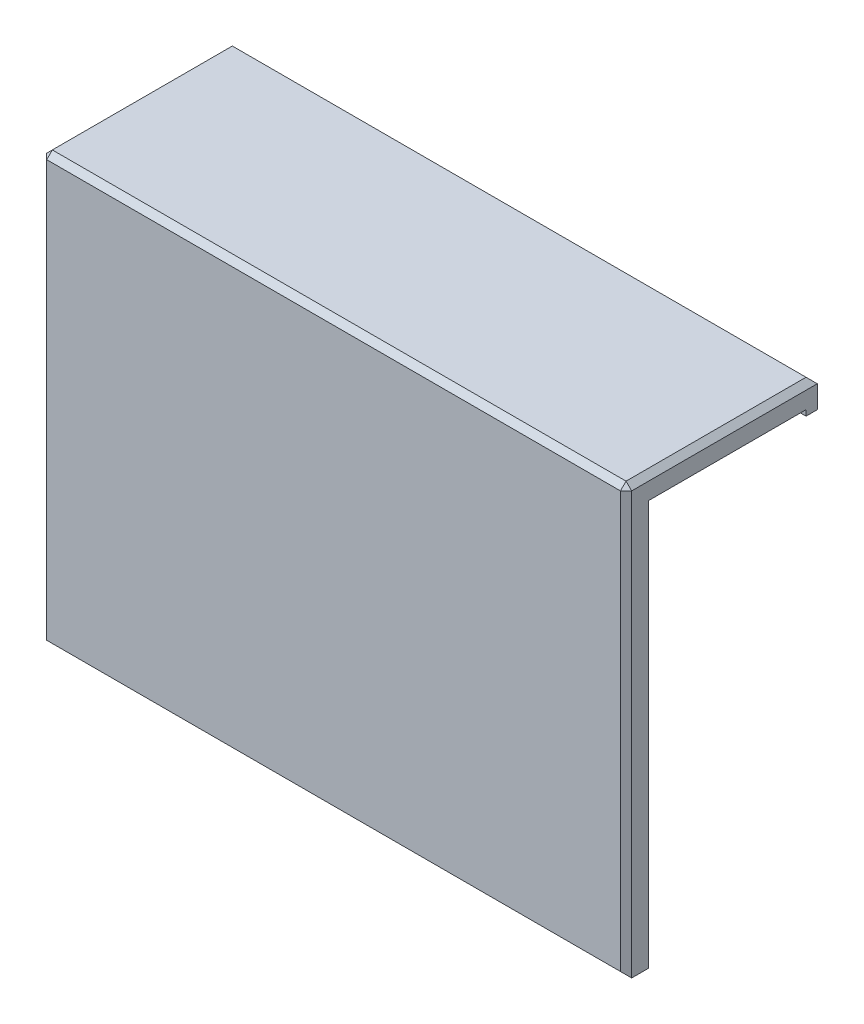
ISO-10303-21;
HEADER;
FILE_DESCRIPTION(('STEP AP214'),'2;1');
FILE_NAME('part.step','',(''),(''),'','','');
FILE_SCHEMA(('AUTOMOTIVE_DESIGN { 1 0 10303 214 1 1 1 1 }'));
ENDSEC;
DATA;
#1=APPLICATION_CONTEXT('core data for automotive mechanical design processes');
#2=APPLICATION_PROTOCOL_DEFINITION('international standard','automotive_design',2000,#1);
#3=PRODUCT_CONTEXT('',#1,'mechanical');
#4=PRODUCT('Part','Part','',(#3));
#5=PRODUCT_RELATED_PRODUCT_CATEGORY('part','',(#4));
#6=PRODUCT_DEFINITION_FORMATION('','',#4);
#7=PRODUCT_DEFINITION_CONTEXT('part definition',#1,'design');
#8=PRODUCT_DEFINITION('design','',#6,#7);
#9=PRODUCT_DEFINITION_SHAPE('','',#8);
#10=(LENGTH_UNIT() NAMED_UNIT(*) SI_UNIT(.MILLI.,.METRE.));
#11=(NAMED_UNIT(*) PLANE_ANGLE_UNIT() SI_UNIT($,.RADIAN.));
#12=(NAMED_UNIT(*) SI_UNIT($,.STERADIAN.) SOLID_ANGLE_UNIT());
#13=UNCERTAINTY_MEASURE_WITH_UNIT(LENGTH_MEASURE(1.E-05),#10,'distance_accuracy_value','');
#14=(GEOMETRIC_REPRESENTATION_CONTEXT(3) GLOBAL_UNCERTAINTY_ASSIGNED_CONTEXT((#13)) GLOBAL_UNIT_ASSIGNED_CONTEXT((#10,
#11,#12)) REPRESENTATION_CONTEXT('',''));
#15=CARTESIAN_POINT('',(0.,0.,0.));
#16=DIRECTION('',(0.,0.,1.));
#17=DIRECTION('',(1.,0.,0.));
#18=AXIS2_PLACEMENT_3D('',#15,#16,#17);
#19=CARTESIAN_POINT('',(0.,0.,-31.));
#20=DIRECTION('',(0.,0.,-1.));
#21=DIRECTION('',(-1.,0.,0.));
#22=AXIS2_PLACEMENT_3D('',#19,#20,#21);
#23=PLANE('',#22);
#24=DIRECTION('',(0.,1.,0.));
#25=VECTOR('',#24,1.);
#26=CARTESIAN_POINT('',(81.,0.,-31.));
#27=LINE('',#26,#25);
#28=CARTESIAN_POINT('',(81.,69.8,-31.));
#29=VERTEX_POINT('',#28);
#30=CARTESIAN_POINT('',(81.,72.,-31.));
#31=VERTEX_POINT('',#30);
#32=EDGE_CURVE('E222',#29,#31,#27,.T.);
#33=ORIENTED_EDGE('',*,*,#32,.F.);
#34=DIRECTION('',(-1.,0.,0.));
#35=VECTOR('',#34,1.);
#36=CARTESIAN_POINT('',(81.,69.8,-31.));
#37=LINE('',#36,#35);
#38=CARTESIAN_POINT('',(70.,69.8,-31.));
#39=VERTEX_POINT('',#38);
#40=EDGE_CURVE('E235',#29,#39,#37,.T.);
#41=ORIENTED_EDGE('',*,*,#40,.T.);
#42=DIRECTION('',(0.,1.,0.));
#43=VECTOR('',#42,1.);
#44=CARTESIAN_POINT('',(70.,0.,-31.));
#45=LINE('',#44,#43);
#46=CARTESIAN_POINT('',(70.,72.,-31.));
#47=VERTEX_POINT('',#46);
#48=EDGE_CURVE('E241',#39,#47,#45,.T.);
#49=ORIENTED_EDGE('',*,*,#48,.T.);
#50=DIRECTION('',(-1.,0.,0.));
#51=VECTOR('',#50,1.);
#52=CARTESIAN_POINT('',(0.,72.,-31.));
#53=LINE('',#52,#51);
#54=CARTESIAN_POINT('',(30.,72.,-31.));
#55=VERTEX_POINT('',#54);
#56=EDGE_CURVE('E328',#47,#55,#53,.T.);
#57=ORIENTED_EDGE('',*,*,#56,.T.);
#58=DIRECTION('',(0.,1.,0.));
#59=VECTOR('',#58,1.);
#60=CARTESIAN_POINT('',(30.,0.,-31.));
#61=LINE('',#60,#59);
#62=CARTESIAN_POINT('',(30.,69.8,-31.));
#63=VERTEX_POINT('',#62);
#64=EDGE_CURVE('E254',#63,#55,#61,.T.);
#65=ORIENTED_EDGE('',*,*,#64,.F.);
#66=DIRECTION('',(1.,0.,0.));
#67=VECTOR('',#66,1.);
#68=CARTESIAN_POINT('',(19.,69.8,-31.));
#69=LINE('',#68,#67);
#70=CARTESIAN_POINT('',(19.,69.8,-31.));
#71=VERTEX_POINT('',#70);
#72=EDGE_CURVE('E253',#71,#63,#69,.T.);
#73=ORIENTED_EDGE('',*,*,#72,.F.);
#74=DIRECTION('',(0.,1.,0.));
#75=VECTOR('',#74,1.);
#76=CARTESIAN_POINT('',(19.,0.,-31.));
#77=LINE('',#76,#75);
#78=CARTESIAN_POINT('',(19.,72.,-31.));
#79=VERTEX_POINT('',#78);
#80=EDGE_CURVE('E247',#71,#79,#77,.T.);
#81=ORIENTED_EDGE('',*,*,#80,.T.);
#82=CARTESIAN_POINT('',(0.,72.,-31.));
#83=VERTEX_POINT('',#82);
#84=EDGE_CURVE('E322',#79,#83,#53,.T.);
#85=ORIENTED_EDGE('',*,*,#84,.T.);
#86=DIRECTION('',(0.,-1.,0.));
#87=VECTOR('',#86,1.);
#88=CARTESIAN_POINT('',(0.,70.,-31.));
#89=LINE('',#88,#87);
#90=CARTESIAN_POINT('',(0.,70.,-31.));
#91=VERTEX_POINT('',#90);
#92=EDGE_CURVE('E326',#83,#91,#89,.T.);
#93=ORIENTED_EDGE('',*,*,#92,.T.);
#94=DIRECTION('',(-1.,0.,0.));
#95=VECTOR('',#94,1.);
#96=CARTESIAN_POINT('',(-2.,70.,-31.));
#97=LINE('',#96,#95);
#98=CARTESIAN_POINT('',(-2.,70.,-31.));
#99=VERTEX_POINT('',#98);
#100=EDGE_CURVE('E332',#91,#99,#97,.T.);
#101=ORIENTED_EDGE('',*,*,#100,.T.);
#102=DIRECTION('',(0.,1.,0.));
#103=VECTOR('',#102,1.);
#104=CARTESIAN_POINT('',(-2.,74.,-31.));
#105=LINE('',#104,#103);
#106=CARTESIAN_POINT('',(-2.,69.,-31.));
#107=VERTEX_POINT('',#106);
#108=EDGE_CURVE('E268',#107,#99,#105,.T.);
#109=ORIENTED_EDGE('',*,*,#108,.F.);
#110=DIRECTION('',(-1.,0.,0.));
#111=VECTOR('',#110,1.);
#112=CARTESIAN_POINT('',(102.,69.,-31.));
#113=LINE('',#112,#111);
#114=CARTESIAN_POINT('',(102.,69.,-31.));
#115=VERTEX_POINT('',#114);
#116=EDGE_CURVE('E275',#115,#107,#113,.T.);
#117=ORIENTED_EDGE('',*,*,#116,.F.);
#118=DIRECTION('',(0.,-1.,0.));
#119=VECTOR('',#118,1.);
#120=CARTESIAN_POINT('',(102.,74.,-31.));
#121=LINE('',#120,#119);
#122=CARTESIAN_POINT('',(102.,70.,-31.));
#123=VERTEX_POINT('',#122);
#124=EDGE_CURVE('E264',#123,#115,#121,.T.);
#125=ORIENTED_EDGE('',*,*,#124,.F.);
#126=DIRECTION('',(-1.,0.,0.));
#127=VECTOR('',#126,1.);
#128=CARTESIAN_POINT('',(100.,70.,-31.));
#129=LINE('',#128,#127);
#130=CARTESIAN_POINT('',(100.,70.,-31.));
#131=VERTEX_POINT('',#130);
#132=EDGE_CURVE('E315',#123,#131,#129,.T.);
#133=ORIENTED_EDGE('',*,*,#132,.T.);
#134=DIRECTION('',(0.,1.,0.));
#135=VECTOR('',#134,1.);
#136=CARTESIAN_POINT('',(100.,72.,-31.));
#137=LINE('',#136,#135);
#138=CARTESIAN_POINT('',(100.,72.,-31.));
#139=VERTEX_POINT('',#138);
#140=EDGE_CURVE('E318',#131,#139,#137,.T.);
#141=ORIENTED_EDGE('',*,*,#140,.T.);
#142=EDGE_CURVE('E323',#139,#31,#53,.T.);
#143=ORIENTED_EDGE('',*,*,#142,.T.);
#144=EDGE_LOOP('',(#33,#41,#49,#57,#65,#73,#81,#85,#93,#101,#109,#117,#125,#133,#141,#143));
#145=FACE_BOUND('',#144,.T.);
#146=ADVANCED_FACE('F37',(#145),#23,.F.);
#147=CARTESIAN_POINT('',(0.,0.,-3.));
#148=DIRECTION('',(0.,0.,1.));
#149=DIRECTION('',(1.,0.,0.));
#150=AXIS2_PLACEMENT_3D('',#147,#148,#149);
#151=PLANE('',#150);
#152=DIRECTION('',(-1.,0.,0.));
#153=VECTOR('',#152,1.);
#154=CARTESIAN_POINT('',(100.,70.,-3.));
#155=LINE('',#154,#153);
#156=CARTESIAN_POINT('',(102.,70.,-3.));
#157=VERTEX_POINT('',#156);
#158=CARTESIAN_POINT('',(100.,70.,-3.));
#159=VERTEX_POINT('',#158);
#160=EDGE_CURVE('E312',#157,#159,#155,.T.);
#161=ORIENTED_EDGE('',*,*,#160,.F.);
#162=DIRECTION('',(0.,1.,0.));
#163=VECTOR('',#162,1.);
#164=CARTESIAN_POINT('',(102.,0.,-3.));
#165=LINE('',#164,#163);
#166=CARTESIAN_POINT('',(102.,-2.,-3.));
#167=VERTEX_POINT('',#166);
#168=EDGE_CURVE('E358',#167,#157,#165,.T.);
#169=ORIENTED_EDGE('',*,*,#168,.F.);
#170=DIRECTION('',(1.,0.,0.));
#171=VECTOR('',#170,1.);
#172=CARTESIAN_POINT('',(-2.,-2.,-3.));
#173=LINE('',#172,#171);
#174=CARTESIAN_POINT('',(-2.,-2.,-3.));
#175=VERTEX_POINT('',#174);
#176=EDGE_CURVE('E307',#175,#167,#173,.T.);
#177=ORIENTED_EDGE('',*,*,#176,.F.);
#178=DIRECTION('',(0.,1.,0.));
#179=VECTOR('',#178,1.);
#180=CARTESIAN_POINT('',(-2.,0.,-3.));
#181=LINE('',#180,#179);
#182=CARTESIAN_POINT('',(-2.,70.,-3.));
#183=VERTEX_POINT('',#182);
#184=EDGE_CURVE('E361',#175,#183,#181,.T.);
#185=ORIENTED_EDGE('',*,*,#184,.T.);
#186=DIRECTION('',(-1.,0.,0.));
#187=VECTOR('',#186,1.);
#188=CARTESIAN_POINT('',(-2.,70.,-3.));
#189=LINE('',#188,#187);
#190=CARTESIAN_POINT('',(0.,70.,-3.));
#191=VERTEX_POINT('',#190);
#192=EDGE_CURVE('E319',#191,#183,#189,.T.);
#193=ORIENTED_EDGE('',*,*,#192,.F.);
#194=DIRECTION('',(0.,1.,0.));
#195=VECTOR('',#194,1.);
#196=CARTESIAN_POINT('',(0.,0.,-3.));
#197=LINE('',#196,#195);
#198=CARTESIAN_POINT('',(0.,0.,-3.));
#199=VERTEX_POINT('',#198);
#200=EDGE_CURVE('E352',#199,#191,#197,.T.);
#201=ORIENTED_EDGE('',*,*,#200,.F.);
#202=DIRECTION('',(1.,0.,0.));
#203=VECTOR('',#202,1.);
#204=CARTESIAN_POINT('',(-2.,0.,-3.));
#205=LINE('',#204,#203);
#206=CARTESIAN_POINT('',(100.,0.,-3.));
#207=VERTEX_POINT('',#206);
#208=EDGE_CURVE('E304',#199,#207,#205,.T.);
#209=ORIENTED_EDGE('',*,*,#208,.T.);
#210=DIRECTION('',(0.,1.,0.));
#211=VECTOR('',#210,1.);
#212=CARTESIAN_POINT('',(100.,0.,-3.));
#213=LINE('',#212,#211);
#214=EDGE_CURVE('E355',#207,#159,#213,.T.);
#215=ORIENTED_EDGE('',*,*,#214,.T.);
#216=EDGE_LOOP('',(#161,#169,#177,#185,#193,#201,#209,#215));
#217=FACE_BOUND('',#216,.T.);
#218=ADVANCED_FACE('F500',(#217),#151,.F.);
#219=CARTESIAN_POINT('',(102.,0.,1.));
#220=DIRECTION('',(-1.,0.,0.));
#221=DIRECTION('',(0.,0.,1.));
#222=AXIS2_PLACEMENT_3D('',#219,#220,#221);
#223=PLANE('',#222);
#224=DIRECTION('',(0.,0.,1.));
#225=VECTOR('',#224,1.);
#226=CARTESIAN_POINT('',(102.,73.,1.));
#227=LINE('',#226,#225);
#228=CARTESIAN_POINT('',(102.,73.,-33.));
#229=VERTEX_POINT('',#228);
#230=CARTESIAN_POINT('',(102.,73.,0.));
#231=VERTEX_POINT('',#230);
#232=EDGE_CURVE('E47',#229,#231,#227,.T.);
#233=ORIENTED_EDGE('',*,*,#232,.T.);
#234=DIRECTION('',(0.,-1.,0.));
#235=VECTOR('',#234,1.);
#236=CARTESIAN_POINT('',(102.,-2.,0.));
#237=LINE('',#236,#235);
#238=CARTESIAN_POINT('',(102.,-2.,0.));
#239=VERTEX_POINT('',#238);
#240=EDGE_CURVE('E11',#231,#239,#237,.T.);
#241=ORIENTED_EDGE('',*,*,#240,.T.);
#242=DIRECTION('',(0.,0.,1.));
#243=VECTOR('',#242,1.);
#244=CARTESIAN_POINT('',(102.,-2.,1.));
#245=LINE('',#244,#243);
#246=EDGE_CURVE('E310',#167,#239,#245,.T.);
#247=ORIENTED_EDGE('',*,*,#246,.F.);
#248=ORIENTED_EDGE('',*,*,#168,.T.);
#249=DIRECTION('',(0.,0.,1.));
#250=VECTOR('',#249,1.);
#251=CARTESIAN_POINT('',(102.,70.,-31.));
#252=LINE('',#251,#250);
#253=EDGE_CURVE('E348',#123,#157,#252,.T.);
#254=ORIENTED_EDGE('',*,*,#253,.F.);
#255=ORIENTED_EDGE('',*,*,#124,.T.);
#256=DIRECTION('',(0.,0.,1.));
#257=VECTOR('',#256,1.);
#258=CARTESIAN_POINT('',(102.,69.,-33.));
#259=LINE('',#258,#257);
#260=CARTESIAN_POINT('',(102.,69.,-33.));
#261=VERTEX_POINT('',#260);
#262=EDGE_CURVE('E281',#261,#115,#259,.T.);
#263=ORIENTED_EDGE('',*,*,#262,.F.);
#264=DIRECTION('',(0.,-1.,0.));
#265=VECTOR('',#264,1.);
#266=CARTESIAN_POINT('',(102.,74.,-33.));
#267=LINE('',#266,#265);
#268=EDGE_CURVE('E265',#229,#261,#267,.T.);
#269=ORIENTED_EDGE('',*,*,#268,.F.);
#270=EDGE_LOOP('',(#233,#241,#247,#248,#254,#255,#263,#269));
#271=FACE_BOUND('',#270,.T.);
#272=ADVANCED_FACE('F503',(#271),#223,.F.);
#273=CARTESIAN_POINT('',(0.,74.,1.));
#274=DIRECTION('',(0.,1.,0.));
#275=DIRECTION('',(0.,0.,1.));
#276=AXIS2_PLACEMENT_3D('',#273,#274,#275);
#277=PLANE('',#276);
#278=DIRECTION('',(-1.,0.,0.));
#279=VECTOR('',#278,1.);
#280=CARTESIAN_POINT('',(0.,74.,-32.));
#281=LINE('',#280,#279);
#282=CARTESIAN_POINT('',(101.,74.,-32.));
#283=VERTEX_POINT('',#282);
#284=CARTESIAN_POINT('',(-1.00000000000001,74.,-32.));
#285=VERTEX_POINT('',#284);
#286=EDGE_CURVE('E391',#283,#285,#281,.T.);
#287=ORIENTED_EDGE('',*,*,#286,.T.);
#288=DIRECTION('',(0.,0.,1.));
#289=VECTOR('',#288,1.);
#290=CARTESIAN_POINT('',(-1.00000000000001,74.,1.));
#291=LINE('',#290,#289);
#292=CARTESIAN_POINT('',(-1.00000000000001,74.,0.));
#293=VERTEX_POINT('',#292);
#294=EDGE_CURVE('E394',#285,#293,#291,.T.);
#295=ORIENTED_EDGE('',*,*,#294,.T.);
#296=DIRECTION('',(1.,0.,0.));
#297=VECTOR('',#296,1.);
#298=CARTESIAN_POINT('',(0.,74.,0.));
#299=LINE('',#298,#297);
#300=CARTESIAN_POINT('',(101.,74.,0.));
#301=VERTEX_POINT('',#300);
#302=EDGE_CURVE('E389',#293,#301,#299,.T.);
#303=ORIENTED_EDGE('',*,*,#302,.T.);
#304=DIRECTION('',(0.,0.,-1.));
#305=VECTOR('',#304,1.);
#306=CARTESIAN_POINT('',(101.,74.,-33.));
#307=LINE('',#306,#305);
#308=EDGE_CURVE('E387',#301,#283,#307,.T.);
#309=ORIENTED_EDGE('',*,*,#308,.T.);
#310=EDGE_LOOP('',(#287,#295,#303,#309));
#311=FACE_BOUND('',#310,.T.);
#312=ADVANCED_FACE('F466',(#311),#277,.T.);
#313=CARTESIAN_POINT('',(-2.,0.,1.));
#314=DIRECTION('',(-1.,0.,0.));
#315=DIRECTION('',(0.,0.,1.));
#316=AXIS2_PLACEMENT_3D('',#313,#314,#315);
#317=PLANE('',#316);
#318=DIRECTION('',(0.,1.,0.));
#319=VECTOR('',#318,1.);
#320=CARTESIAN_POINT('',(-2.,0.,0.));
#321=LINE('',#320,#319);
#322=CARTESIAN_POINT('',(-2.,-2.,0.));
#323=VERTEX_POINT('',#322);
#324=CARTESIAN_POINT('',(-2.,73.,0.));
#325=VERTEX_POINT('',#324);
#326=EDGE_CURVE('E405',#323,#325,#321,.T.);
#327=ORIENTED_EDGE('',*,*,#326,.T.);
#328=DIRECTION('',(0.,0.,-1.));
#329=VECTOR('',#328,1.);
#330=CARTESIAN_POINT('',(-2.,73.,1.));
#331=LINE('',#330,#329);
#332=CARTESIAN_POINT('',(-2.,73.,-33.));
#333=VERTEX_POINT('',#332);
#334=EDGE_CURVE('E407',#325,#333,#331,.T.);
#335=ORIENTED_EDGE('',*,*,#334,.T.);
#336=DIRECTION('',(0.,1.,0.));
#337=VECTOR('',#336,1.);
#338=CARTESIAN_POINT('',(-2.,74.,-33.));
#339=LINE('',#338,#337);
#340=CARTESIAN_POINT('',(-2.,69.,-33.));
#341=VERTEX_POINT('',#340);
#342=EDGE_CURVE('E270',#341,#333,#339,.T.);
#343=ORIENTED_EDGE('',*,*,#342,.F.);
#344=DIRECTION('',(0.,0.,1.));
#345=VECTOR('',#344,1.);
#346=CARTESIAN_POINT('',(-2.,69.,-33.));
#347=LINE('',#346,#345);
#348=EDGE_CURVE('E273',#341,#107,#347,.T.);
#349=ORIENTED_EDGE('',*,*,#348,.T.);
#350=ORIENTED_EDGE('',*,*,#108,.T.);
#351=DIRECTION('',(0.,0.,1.));
#352=VECTOR('',#351,1.);
#353=CARTESIAN_POINT('',(-2.,70.,-31.));
#354=LINE('',#353,#352);
#355=EDGE_CURVE('E335',#99,#183,#354,.T.);
#356=ORIENTED_EDGE('',*,*,#355,.T.);
#357=ORIENTED_EDGE('',*,*,#184,.F.);
#358=DIRECTION('',(0.,0.,-1.));
#359=VECTOR('',#358,1.);
#360=CARTESIAN_POINT('',(-2.,-2.,1.));
#361=LINE('',#360,#359);
#362=EDGE_CURVE('E305',#323,#175,#361,.T.);
#363=ORIENTED_EDGE('',*,*,#362,.F.);
#364=EDGE_LOOP('',(#327,#335,#343,#349,#350,#356,#357,#363));
#365=FACE_BOUND('',#364,.T.);
#366=ADVANCED_FACE('F480',(#365),#317,.T.);
#367=CARTESIAN_POINT('',(0.,0.,1.));
#368=DIRECTION('',(0.,0.,1.));
#369=DIRECTION('',(1.,0.,0.));
#370=AXIS2_PLACEMENT_3D('',#367,#368,#369);
#371=PLANE('',#370);
#372=DIRECTION('',(0.,1.,0.));
#373=VECTOR('',#372,1.);
#374=CARTESIAN_POINT('',(101.,74.,1.));
#375=LINE('',#374,#373);
#376=CARTESIAN_POINT('',(101.,-0.999999999999999,1.));
#377=VERTEX_POINT('',#376);
#378=CARTESIAN_POINT('',(101.,73.,1.));
#379=VERTEX_POINT('',#378);
#380=EDGE_CURVE('E396',#377,#379,#375,.T.);
#381=ORIENTED_EDGE('',*,*,#380,.T.);
#382=DIRECTION('',(-1.,0.,0.));
#383=VECTOR('',#382,1.);
#384=CARTESIAN_POINT('',(0.,73.,1.));
#385=LINE('',#384,#383);
#386=CARTESIAN_POINT('',(-0.999999999999999,73.,1.));
#387=VERTEX_POINT('',#386);
#388=EDGE_CURVE('E402',#379,#387,#385,.T.);
#389=ORIENTED_EDGE('',*,*,#388,.T.);
#390=DIRECTION('',(0.,-1.,0.));
#391=VECTOR('',#390,1.);
#392=CARTESIAN_POINT('',(-0.999999999999999,0.,1.));
#393=LINE('',#392,#391);
#394=CARTESIAN_POINT('',(-0.999999999999999,-0.999999999999999,1.));
#395=VERTEX_POINT('',#394);
#396=EDGE_CURVE('E400',#387,#395,#393,.T.);
#397=ORIENTED_EDGE('',*,*,#396,.T.);
#398=DIRECTION('',(1.,0.,0.));
#399=VECTOR('',#398,1.);
#400=CARTESIAN_POINT('',(0.,-0.999999999999999,1.));
#401=LINE('',#400,#399);
#402=EDGE_CURVE('E398',#395,#377,#401,.T.);
#403=ORIENTED_EDGE('',*,*,#402,.T.);
#404=EDGE_LOOP('',(#381,#389,#397,#403));
#405=FACE_BOUND('',#404,.T.);
#406=ADVANCED_FACE('F448',(#405),#371,.T.);
#407=CARTESIAN_POINT('',(0.,0.,0.));
#408=DIRECTION('',(0.,0.,1.));
#409=DIRECTION('',(1.,0.,0.));
#410=AXIS2_PLACEMENT_3D('',#407,#408,#409);
#411=PLANE('',#410);
#412=DIRECTION('',(1.,0.,0.));
#413=VECTOR('',#412,1.);
#414=CARTESIAN_POINT('',(0.,0.,0.));
#415=LINE('',#414,#413);
#416=CARTESIAN_POINT('',(0.,0.,0.));
#417=VERTEX_POINT('',#416);
#418=CARTESIAN_POINT('',(39.,0.,0.));
#419=VERTEX_POINT('',#418);
#420=EDGE_CURVE('E380',#417,#419,#415,.T.);
#421=ORIENTED_EDGE('',*,*,#420,.F.);
#422=DIRECTION('',(0.,1.,0.));
#423=VECTOR('',#422,1.);
#424=CARTESIAN_POINT('',(0.,0.,0.));
#425=LINE('',#424,#423);
#426=CARTESIAN_POINT('',(0.,72.,0.));
#427=VERTEX_POINT('',#426);
#428=EDGE_CURVE('E351',#417,#427,#425,.T.);
#429=ORIENTED_EDGE('',*,*,#428,.T.);
#430=DIRECTION('',(1.,0.,0.));
#431=VECTOR('',#430,1.);
#432=CARTESIAN_POINT('',(0.,72.,0.));
#433=LINE('',#432,#431);
#434=CARTESIAN_POINT('',(100.,72.,0.));
#435=VERTEX_POINT('',#434);
#436=EDGE_CURVE('E365',#427,#435,#433,.T.);
#437=ORIENTED_EDGE('',*,*,#436,.T.);
#438=DIRECTION('',(0.,1.,0.));
#439=VECTOR('',#438,1.);
#440=CARTESIAN_POINT('',(100.,0.,0.));
#441=LINE('',#440,#439);
#442=CARTESIAN_POINT('',(100.,0.,0.));
#443=VERTEX_POINT('',#442);
#444=EDGE_CURVE('E356',#443,#435,#441,.T.);
#445=ORIENTED_EDGE('',*,*,#444,.F.);
#446=CARTESIAN_POINT('',(61.,0.,0.));
#447=VERTEX_POINT('',#446);
#448=EDGE_CURVE('E372',#447,#443,#415,.T.);
#449=ORIENTED_EDGE('',*,*,#448,.F.);
#450=EDGE_CURVE('E384',#419,#447,#415,.T.);
#451=ORIENTED_EDGE('',*,*,#450,.F.);
#452=EDGE_LOOP('',(#421,#429,#437,#445,#449,#451));
#453=FACE_BOUND('',#452,.T.);
#454=ADVANCED_FACE('F542',(#453),#411,.F.);
#455=CARTESIAN_POINT('',(100.,0.,-3.));
#456=DIRECTION('',(1.,0.,0.));
#457=DIRECTION('',(0.,0.,-1.));
#458=AXIS2_PLACEMENT_3D('',#455,#456,#457);
#459=PLANE('',#458);
#460=ORIENTED_EDGE('',*,*,#444,.T.);
#461=DIRECTION('',(0.,0.,1.));
#462=VECTOR('',#461,1.);
#463=CARTESIAN_POINT('',(100.,72.,-3.));
#464=LINE('',#463,#462);
#465=EDGE_CURVE('E373',#139,#435,#464,.T.);
#466=ORIENTED_EDGE('',*,*,#465,.F.);
#467=ORIENTED_EDGE('',*,*,#140,.F.);
#468=DIRECTION('',(0.,0.,1.));
#469=VECTOR('',#468,1.);
#470=CARTESIAN_POINT('',(100.,70.,-31.));
#471=LINE('',#470,#469);
#472=EDGE_CURVE('E345',#131,#159,#471,.T.);
#473=ORIENTED_EDGE('',*,*,#472,.T.);
#474=ORIENTED_EDGE('',*,*,#214,.F.);
#475=DIRECTION('',(0.,0.,1.));
#476=VECTOR('',#475,1.);
#477=CARTESIAN_POINT('',(100.,0.,-3.));
#478=LINE('',#477,#476);
#479=EDGE_CURVE('E369',#207,#443,#478,.T.);
#480=ORIENTED_EDGE('',*,*,#479,.T.);
#481=EDGE_LOOP('',(#460,#466,#467,#473,#474,#480));
#482=FACE_BOUND('',#481,.T.);
#483=ADVANCED_FACE('F510',(#482),#459,.F.);
#484=CARTESIAN_POINT('',(0.,72.,-3.));
#485=DIRECTION('',(0.,-1.,0.));
#486=DIRECTION('',(0.,0.,-1.));
#487=AXIS2_PLACEMENT_3D('',#484,#485,#486);
#488=PLANE('',#487);
#489=ORIENTED_EDGE('',*,*,#436,.F.);
#490=DIRECTION('',(0.,0.,1.));
#491=VECTOR('',#490,1.);
#492=CARTESIAN_POINT('',(0.,72.,-3.));
#493=LINE('',#492,#491);
#494=EDGE_CURVE('E376',#83,#427,#493,.T.);
#495=ORIENTED_EDGE('',*,*,#494,.F.);
#496=ORIENTED_EDGE('',*,*,#84,.F.);
#497=EDGE_CURVE('E329',#55,#79,#53,.T.);
#498=ORIENTED_EDGE('',*,*,#497,.F.);
#499=ORIENTED_EDGE('',*,*,#56,.F.);
#500=EDGE_CURVE('E327',#31,#47,#53,.T.);
#501=ORIENTED_EDGE('',*,*,#500,.F.);
#502=ORIENTED_EDGE('',*,*,#142,.F.);
#503=ORIENTED_EDGE('',*,*,#465,.T.);
#504=EDGE_LOOP('',(#489,#495,#496,#498,#499,#501,#502,#503));
#505=FACE_BOUND('',#504,.T.);
#506=ADVANCED_FACE('F515',(#505),#488,.T.);
#507=CARTESIAN_POINT('',(0.,0.,-3.));
#508=DIRECTION('',(1.,0.,0.));
#509=DIRECTION('',(0.,0.,-1.));
#510=AXIS2_PLACEMENT_3D('',#507,#508,#509);
#511=PLANE('',#510);
#512=ORIENTED_EDGE('',*,*,#428,.F.);
#513=DIRECTION('',(0.,0.,1.));
#514=VECTOR('',#513,1.);
#515=CARTESIAN_POINT('',(0.,0.,-3.));
#516=LINE('',#515,#514);
#517=EDGE_CURVE('E363',#199,#417,#516,.T.);
#518=ORIENTED_EDGE('',*,*,#517,.F.);
#519=ORIENTED_EDGE('',*,*,#200,.T.);
#520=DIRECTION('',(0.,0.,1.));
#521=VECTOR('',#520,1.);
#522=CARTESIAN_POINT('',(0.,70.,-31.));
#523=LINE('',#522,#521);
#524=EDGE_CURVE('E342',#91,#191,#523,.T.);
#525=ORIENTED_EDGE('',*,*,#524,.F.);
#526=ORIENTED_EDGE('',*,*,#92,.F.);
#527=ORIENTED_EDGE('',*,*,#494,.T.);
#528=EDGE_LOOP('',(#512,#518,#519,#525,#526,#527));
#529=FACE_BOUND('',#528,.T.);
#530=ADVANCED_FACE('F533',(#529),#511,.T.);
#531=CARTESIAN_POINT('',(100.,70.,-31.));
#532=DIRECTION('',(0.,1.,0.));
#533=DIRECTION('',(0.,0.,1.));
#534=AXIS2_PLACEMENT_3D('',#531,#532,#533);
#535=PLANE('',#534);
#536=ORIENTED_EDGE('',*,*,#160,.T.);
#537=ORIENTED_EDGE('',*,*,#472,.F.);
#538=ORIENTED_EDGE('',*,*,#132,.F.);
#539=ORIENTED_EDGE('',*,*,#253,.T.);
#540=EDGE_LOOP('',(#536,#537,#538,#539));
#541=FACE_BOUND('',#540,.T.);
#542=ADVANCED_FACE('F506',(#541),#535,.F.);
#543=CARTESIAN_POINT('',(-2.,70.,-31.));
#544=DIRECTION('',(0.,1.,0.));
#545=DIRECTION('',(0.,0.,1.));
#546=AXIS2_PLACEMENT_3D('',#543,#544,#545);
#547=PLANE('',#546);
#548=ORIENTED_EDGE('',*,*,#192,.T.);
#549=ORIENTED_EDGE('',*,*,#355,.F.);
#550=ORIENTED_EDGE('',*,*,#100,.F.);
#551=ORIENTED_EDGE('',*,*,#524,.T.);
#552=EDGE_LOOP('',(#548,#549,#550,#551));
#553=FACE_BOUND('',#552,.T.);
#554=ADVANCED_FACE('F496',(#553),#547,.F.);
#555=CARTESIAN_POINT('',(0.,0.,0.));
#556=DIRECTION('',(0.,-1.,0.));
#557=DIRECTION('',(0.,0.,-1.));
#558=AXIS2_PLACEMENT_3D('',#555,#556,#557);
#559=PLANE('',#558);
#560=ORIENTED_EDGE('',*,*,#420,.T.);
#561=DIRECTION('',(0.,0.,1.));
#562=VECTOR('',#561,1.);
#563=CARTESIAN_POINT('',(39.,0.,0.));
#564=LINE('',#563,#562);
#565=CARTESIAN_POINT('',(39.,0.,-2.2));
#566=VERTEX_POINT('',#565);
#567=EDGE_CURVE('E295',#566,#419,#564,.T.);
#568=ORIENTED_EDGE('',*,*,#567,.F.);
#569=DIRECTION('',(1.,0.,0.));
#570=VECTOR('',#569,1.);
#571=CARTESIAN_POINT('',(39.,0.,-2.2));
#572=LINE('',#571,#570);
#573=CARTESIAN_POINT('',(61.,0.,-2.2));
#574=VERTEX_POINT('',#573);
#575=EDGE_CURVE('E298',#566,#574,#572,.T.);
#576=ORIENTED_EDGE('',*,*,#575,.T.);
#577=DIRECTION('',(0.,0.,1.));
#578=VECTOR('',#577,1.);
#579=CARTESIAN_POINT('',(61.,0.,0.));
#580=LINE('',#579,#578);
#581=EDGE_CURVE('E288',#574,#447,#580,.T.);
#582=ORIENTED_EDGE('',*,*,#581,.T.);
#583=ORIENTED_EDGE('',*,*,#448,.T.);
#584=ORIENTED_EDGE('',*,*,#479,.F.);
#585=ORIENTED_EDGE('',*,*,#208,.F.);
#586=ORIENTED_EDGE('',*,*,#517,.T.);
#587=EDGE_LOOP('',(#560,#568,#576,#582,#583,#584,#585,#586));
#588=FACE_BOUND('',#587,.T.);
#589=ADVANCED_FACE('F537',(#588),#559,.F.);
#590=CARTESIAN_POINT('',(0.,-2.,0.));
#591=DIRECTION('',(0.,-1.,0.));
#592=DIRECTION('',(0.,0.,-1.));
#593=AXIS2_PLACEMENT_3D('',#590,#591,#592);
#594=PLANE('',#593);
#595=ORIENTED_EDGE('',*,*,#246,.T.);
#596=DIRECTION('',(-1.,0.,0.));
#597=VECTOR('',#596,1.);
#598=CARTESIAN_POINT('',(0.,-2.,0.));
#599=LINE('',#598,#597);
#600=EDGE_CURVE('E409',#239,#323,#599,.T.);
#601=ORIENTED_EDGE('',*,*,#600,.T.);
#602=ORIENTED_EDGE('',*,*,#362,.T.);
#603=ORIENTED_EDGE('',*,*,#176,.T.);
#604=EDGE_LOOP('',(#595,#601,#602,#603));
#605=FACE_BOUND('',#604,.T.);
#606=ADVANCED_FACE('F502',(#605),#594,.T.);
#607=CARTESIAN_POINT('',(39.,0.,0.));
#608=DIRECTION('',(0.,1.,0.));
#609=DIRECTION('',(0.,0.,1.));
#610=AXIS2_PLACEMENT_3D('',#607,#608,#609);
#611=PLANE('',#610);
#612=CARTESIAN_POINT('',(61.,0.,0.2));
#613=VERTEX_POINT('',#612);
#614=EDGE_CURVE('E287',#447,#613,#580,.T.);
#615=ORIENTED_EDGE('',*,*,#614,.T.);
#616=DIRECTION('',(1.,0.,0.));
#617=VECTOR('',#616,1.);
#618=CARTESIAN_POINT('',(39.,0.,0.2));
#619=LINE('',#618,#617);
#620=CARTESIAN_POINT('',(39.,0.,0.2));
#621=VERTEX_POINT('',#620);
#622=EDGE_CURVE('E301',#621,#613,#619,.T.);
#623=ORIENTED_EDGE('',*,*,#622,.F.);
#624=EDGE_CURVE('E294',#419,#621,#564,.T.);
#625=ORIENTED_EDGE('',*,*,#624,.F.);
#626=ORIENTED_EDGE('',*,*,#450,.T.);
#627=EDGE_LOOP('',(#615,#623,#625,#626));
#628=FACE_BOUND('',#627,.T.);
#629=ADVANCED_FACE('F555',(#628),#611,.F.);
#630=CARTESIAN_POINT('',(39.,0.,-1.));
#631=DIRECTION('',(1.,0.,0.));
#632=DIRECTION('',(0.,0.,-1.));
#633=AXIS2_PLACEMENT_3D('',#630,#631,#632);
#634=CYLINDRICAL_SURFACE('',#633,1.2);
#635=ORIENTED_EDGE('',*,*,#575,.F.);
#636=CARTESIAN_POINT('',(39.,0.,-1.));
#637=DIRECTION('',(-1.,0.,0.));
#638=DIRECTION('',(0.,0.,1.));
#639=AXIS2_PLACEMENT_3D('',#636,#637,#638);
#640=CIRCLE('',#639,1.2);
#641=EDGE_CURVE('E291',#621,#566,#640,.F.);
#642=ORIENTED_EDGE('',*,*,#641,.F.);
#643=ORIENTED_EDGE('',*,*,#622,.T.);
#644=CARTESIAN_POINT('',(61.,0.,-1.));
#645=DIRECTION('',(-1.,0.,0.));
#646=DIRECTION('',(0.,0.,1.));
#647=AXIS2_PLACEMENT_3D('',#644,#645,#646);
#648=CIRCLE('',#647,1.2);
#649=EDGE_CURVE('E284',#613,#574,#648,.F.);
#650=ORIENTED_EDGE('',*,*,#649,.T.);
#651=EDGE_LOOP('',(#635,#642,#643,#650));
#652=FACE_BOUND('',#651,.T.);
#653=ADVANCED_FACE('F550',(#652),#634,.F.);
#654=CARTESIAN_POINT('',(39.,0.,0.));
#655=DIRECTION('',(-1.,0.,0.));
#656=DIRECTION('',(0.,0.,1.));
#657=AXIS2_PLACEMENT_3D('',#654,#655,#656);
#658=PLANE('',#657);
#659=ORIENTED_EDGE('',*,*,#641,.T.);
#660=ORIENTED_EDGE('',*,*,#567,.T.);
#661=ORIENTED_EDGE('',*,*,#624,.T.);
#662=EDGE_LOOP('',(#659,#660,#661));
#663=FACE_BOUND('',#662,.T.);
#664=ADVANCED_FACE('F546',(#663),#658,.F.);
#665=CARTESIAN_POINT('',(61.,0.,0.));
#666=DIRECTION('',(-1.,0.,0.));
#667=DIRECTION('',(0.,0.,1.));
#668=AXIS2_PLACEMENT_3D('',#665,#666,#667);
#669=PLANE('',#668);
#670=ORIENTED_EDGE('',*,*,#649,.F.);
#671=ORIENTED_EDGE('',*,*,#614,.F.);
#672=ORIENTED_EDGE('',*,*,#581,.F.);
#673=EDGE_LOOP('',(#670,#671,#672));
#674=FACE_BOUND('',#673,.T.);
#675=ADVANCED_FACE('F553',(#674),#669,.T.);
#676=CARTESIAN_POINT('',(102.,69.,-33.));
#677=DIRECTION('',(0.,1.,0.));
#678=DIRECTION('',(0.,0.,1.));
#679=AXIS2_PLACEMENT_3D('',#676,#677,#678);
#680=PLANE('',#679);
#681=ORIENTED_EDGE('',*,*,#116,.T.);
#682=ORIENTED_EDGE('',*,*,#348,.F.);
#683=DIRECTION('',(-1.,0.,0.));
#684=VECTOR('',#683,1.);
#685=CARTESIAN_POINT('',(102.,69.,-33.));
#686=LINE('',#685,#684);
#687=EDGE_CURVE('E267',#261,#341,#686,.T.);
#688=ORIENTED_EDGE('',*,*,#687,.F.);
#689=ORIENTED_EDGE('',*,*,#262,.T.);
#690=EDGE_LOOP('',(#681,#682,#688,#689));
#691=FACE_BOUND('',#690,.T.);
#692=ADVANCED_FACE('F488',(#691),#680,.F.);
#693=CARTESIAN_POINT('',(0.,0.,-33.));
#694=DIRECTION('',(0.,0.,-1.));
#695=DIRECTION('',(-1.,0.,0.));
#696=AXIS2_PLACEMENT_3D('',#693,#694,#695);
#697=PLANE('',#696);
#698=ORIENTED_EDGE('',*,*,#342,.T.);
#699=DIRECTION('',(1.,0.,0.));
#700=VECTOR('',#699,1.);
#701=CARTESIAN_POINT('',(0.,73.,-33.));
#702=LINE('',#701,#700);
#703=EDGE_CURVE('E383',#333,#229,#702,.T.);
#704=ORIENTED_EDGE('',*,*,#703,.T.);
#705=ORIENTED_EDGE('',*,*,#268,.T.);
#706=ORIENTED_EDGE('',*,*,#687,.T.);
#707=EDGE_LOOP('',(#698,#704,#705,#706));
#708=FACE_BOUND('',#707,.T.);
#709=ADVANCED_FACE('F483',(#708),#697,.T.);
#710=CARTESIAN_POINT('',(19.,0.,-31.));
#711=DIRECTION('',(0.,0.,-1.));
#712=DIRECTION('',(-1.,0.,0.));
#713=AXIS2_PLACEMENT_3D('',#710,#711,#712);
#714=PLANE('',#713);
#715=CARTESIAN_POINT('',(19.,72.2,-31.));
#716=VERTEX_POINT('',#715);
#717=EDGE_CURVE('E251',#79,#716,#77,.T.);
#718=ORIENTED_EDGE('',*,*,#717,.T.);
#719=DIRECTION('',(1.,0.,0.));
#720=VECTOR('',#719,1.);
#721=CARTESIAN_POINT('',(19.,72.2,-31.));
#722=LINE('',#721,#720);
#723=CARTESIAN_POINT('',(30.,72.2,-31.));
#724=VERTEX_POINT('',#723);
#725=EDGE_CURVE('E261',#716,#724,#722,.T.);
#726=ORIENTED_EDGE('',*,*,#725,.T.);
#727=EDGE_CURVE('E245',#55,#724,#61,.T.);
#728=ORIENTED_EDGE('',*,*,#727,.F.);
#729=ORIENTED_EDGE('',*,*,#497,.T.);
#730=EDGE_LOOP('',(#718,#726,#728,#729));
#731=FACE_BOUND('',#730,.T.);
#732=ADVANCED_FACE('F523',(#731),#714,.T.);
#733=CARTESIAN_POINT('',(19.,71.,-31.));
#734=DIRECTION('',(1.,0.,0.));
#735=DIRECTION('',(0.,0.,-1.));
#736=AXIS2_PLACEMENT_3D('',#733,#734,#735);
#737=CYLINDRICAL_SURFACE('',#736,1.20000000000001);
#738=CARTESIAN_POINT('',(30.,71.,-31.));
#739=DIRECTION('',(-1.,0.,0.));
#740=DIRECTION('',(0.,0.,1.));
#741=AXIS2_PLACEMENT_3D('',#738,#739,#740);
#742=CIRCLE('',#741,1.20000000000001);
#743=EDGE_CURVE('E257',#724,#63,#742,.T.);
#744=ORIENTED_EDGE('',*,*,#743,.F.);
#745=ORIENTED_EDGE('',*,*,#725,.F.);
#746=CARTESIAN_POINT('',(19.,71.,-31.));
#747=DIRECTION('',(-1.,0.,0.));
#748=DIRECTION('',(0.,0.,1.));
#749=AXIS2_PLACEMENT_3D('',#746,#747,#748);
#750=CIRCLE('',#749,1.20000000000001);
#751=EDGE_CURVE('E250',#716,#71,#750,.T.);
#752=ORIENTED_EDGE('',*,*,#751,.T.);
#753=ORIENTED_EDGE('',*,*,#72,.T.);
#754=EDGE_LOOP('',(#744,#745,#752,#753));
#755=FACE_BOUND('',#754,.T.);
#756=ADVANCED_FACE('F605',(#755),#737,.F.);
#757=CARTESIAN_POINT('',(19.,0.,0.));
#758=DIRECTION('',(-1.,0.,0.));
#759=DIRECTION('',(0.,0.,1.));
#760=AXIS2_PLACEMENT_3D('',#757,#758,#759);
#761=PLANE('',#760);
#762=ORIENTED_EDGE('',*,*,#80,.F.);
#763=ORIENTED_EDGE('',*,*,#751,.F.);
#764=ORIENTED_EDGE('',*,*,#717,.F.);
#765=EDGE_LOOP('',(#762,#763,#764));
#766=FACE_BOUND('',#765,.T.);
#767=ADVANCED_FACE('F527',(#766),#761,.F.);
#768=CARTESIAN_POINT('',(30.,0.,0.));
#769=DIRECTION('',(-1.,0.,0.));
#770=DIRECTION('',(0.,0.,1.));
#771=AXIS2_PLACEMENT_3D('',#768,#769,#770);
#772=PLANE('',#771);
#773=ORIENTED_EDGE('',*,*,#64,.T.);
#774=ORIENTED_EDGE('',*,*,#727,.T.);
#775=ORIENTED_EDGE('',*,*,#743,.T.);
#776=EDGE_LOOP('',(#773,#774,#775));
#777=FACE_BOUND('',#776,.T.);
#778=ADVANCED_FACE('F618',(#777),#772,.T.);
#779=CARTESIAN_POINT('',(81.,0.,-31.));
#780=DIRECTION('',(0.,0.,1.));
#781=DIRECTION('',(1.,0.,0.));
#782=AXIS2_PLACEMENT_3D('',#779,#780,#781);
#783=PLANE('',#782);
#784=ORIENTED_EDGE('',*,*,#500,.T.);
#785=CARTESIAN_POINT('',(70.,72.2,-31.));
#786=VERTEX_POINT('',#785);
#787=EDGE_CURVE('E231',#47,#786,#45,.T.);
#788=ORIENTED_EDGE('',*,*,#787,.T.);
#789=DIRECTION('',(-1.,0.,0.));
#790=VECTOR('',#789,1.);
#791=CARTESIAN_POINT('',(81.,72.2,-31.));
#792=LINE('',#791,#790);
#793=CARTESIAN_POINT('',(81.,72.2,-31.));
#794=VERTEX_POINT('',#793);
#795=EDGE_CURVE('E229',#794,#786,#792,.T.);
#796=ORIENTED_EDGE('',*,*,#795,.F.);
#797=EDGE_CURVE('E216',#31,#794,#27,.T.);
#798=ORIENTED_EDGE('',*,*,#797,.F.);
#799=EDGE_LOOP('',(#784,#788,#796,#798));
#800=FACE_BOUND('',#799,.T.);
#801=ADVANCED_FACE('F230',(#800),#783,.F.);
#802=CARTESIAN_POINT('',(81.,71.,-31.));
#803=DIRECTION('',(-1.,0.,0.));
#804=DIRECTION('',(0.,0.,1.));
#805=AXIS2_PLACEMENT_3D('',#802,#803,#804);
#806=CYLINDRICAL_SURFACE('',#805,1.20000000000001);
#807=CARTESIAN_POINT('',(70.,71.,-31.));
#808=DIRECTION('',(-1.,0.,0.));
#809=DIRECTION('',(0.,0.,1.));
#810=AXIS2_PLACEMENT_3D('',#807,#808,#809);
#811=CIRCLE('',#810,1.20000000000001);
#812=EDGE_CURVE('E226',#786,#39,#811,.T.);
#813=ORIENTED_EDGE('',*,*,#812,.T.);
#814=ORIENTED_EDGE('',*,*,#40,.F.);
#815=CARTESIAN_POINT('',(81.,71.,-31.));
#816=DIRECTION('',(-1.,0.,0.));
#817=DIRECTION('',(0.,0.,1.));
#818=AXIS2_PLACEMENT_3D('',#815,#816,#817);
#819=CIRCLE('',#818,1.20000000000001);
#820=EDGE_CURVE('E220',#794,#29,#819,.T.);
#821=ORIENTED_EDGE('',*,*,#820,.F.);
#822=ORIENTED_EDGE('',*,*,#795,.T.);
#823=EDGE_LOOP('',(#813,#814,#821,#822));
#824=FACE_BOUND('',#823,.T.);
#825=ADVANCED_FACE('F237',(#824),#806,.F.);
#826=CARTESIAN_POINT('',(81.,0.,0.));
#827=DIRECTION('',(-1.,0.,0.));
#828=DIRECTION('',(0.,0.,1.));
#829=AXIS2_PLACEMENT_3D('',#826,#827,#828);
#830=PLANE('',#829);
#831=ORIENTED_EDGE('',*,*,#32,.T.);
#832=ORIENTED_EDGE('',*,*,#797,.T.);
#833=ORIENTED_EDGE('',*,*,#820,.T.);
#834=EDGE_LOOP('',(#831,#832,#833));
#835=FACE_BOUND('',#834,.T.);
#836=ADVANCED_FACE('F218',(#835),#830,.T.);
#837=CARTESIAN_POINT('',(70.,0.,0.));
#838=DIRECTION('',(-1.,0.,0.));
#839=DIRECTION('',(0.,0.,1.));
#840=AXIS2_PLACEMENT_3D('',#837,#838,#839);
#841=PLANE('',#840);
#842=ORIENTED_EDGE('',*,*,#48,.F.);
#843=ORIENTED_EDGE('',*,*,#812,.F.);
#844=ORIENTED_EDGE('',*,*,#787,.F.);
#845=EDGE_LOOP('',(#842,#843,#844));
#846=FACE_BOUND('',#845,.T.);
#847=ADVANCED_FACE('F645',(#846),#841,.F.);
#848=CARTESIAN_POINT('',(0.,-2.,0.));
#849=DIRECTION('',(0.,0.707106781186547,-0.707106781186548));
#850=DIRECTION('',(-1.,0.,0.));
#851=AXIS2_PLACEMENT_3D('',#848,#849,#850);
#852=PLANE('',#851);
#853=DIRECTION('',(-0.57735026918962,0.577350269189629,0.577350269189628));
#854=VECTOR('',#853,1.);
#855=CARTESIAN_POINT('',(100.666666666667,-0.666666666666663,1.33333333333334));
#856=LINE('',#855,#854);
#857=EDGE_CURVE('E432',#377,#239,#856,.F.);
#858=ORIENTED_EDGE('',*,*,#857,.F.);
#859=ORIENTED_EDGE('',*,*,#402,.F.);
#860=DIRECTION('',(-0.577350269189631,-0.577350269189623,-0.577350269189623));
#861=VECTOR('',#860,1.);
#862=CARTESIAN_POINT('',(-1.33333333333333,-1.33333333333333,0.666666666666674));
#863=LINE('',#862,#861);
#864=EDGE_CURVE('E42',#323,#395,#863,.F.);
#865=ORIENTED_EDGE('',*,*,#864,.F.);
#866=ORIENTED_EDGE('',*,*,#600,.F.);
#867=EDGE_LOOP('',(#858,#859,#865,#866));
#868=FACE_BOUND('',#867,.T.);
#869=ADVANCED_FACE('F40',(#868),#852,.F.);
#870=CARTESIAN_POINT('',(-2.,0.,0.));
#871=DIRECTION('',(0.707106781186543,0.,-0.707106781186552));
#872=DIRECTION('',(0.,1.,0.));
#873=AXIS2_PLACEMENT_3D('',#870,#871,#872);
#874=PLANE('',#873);
#875=ORIENTED_EDGE('',*,*,#864,.T.);
#876=ORIENTED_EDGE('',*,*,#396,.F.);
#877=DIRECTION('',(-0.707106781186552,0.,-0.707106781186543));
#878=VECTOR('',#877,1.);
#879=CARTESIAN_POINT('',(-0.999999999999999,73.,1.));
#880=LINE('',#879,#878);
#881=EDGE_CURVE('E428',#325,#387,#880,.F.);
#882=ORIENTED_EDGE('',*,*,#881,.F.);
#883=ORIENTED_EDGE('',*,*,#326,.F.);
#884=EDGE_LOOP('',(#875,#876,#882,#883));
#885=FACE_BOUND('',#884,.T.);
#886=ADVANCED_FACE('F442',(#885),#874,.F.);
#887=CARTESIAN_POINT('',(101.,0.,1.));
#888=DIRECTION('',(0.707106781186552,0.,0.707106781186543));
#889=DIRECTION('',(0.,-1.,0.));
#890=AXIS2_PLACEMENT_3D('',#887,#888,#889);
#891=PLANE('',#890);
#892=ORIENTED_EDGE('',*,*,#857,.T.);
#893=ORIENTED_EDGE('',*,*,#240,.F.);
#894=DIRECTION('',(0.707106781186543,0.,-0.707106781186552));
#895=VECTOR('',#894,1.);
#896=CARTESIAN_POINT('',(101.5,73.,0.5));
#897=LINE('',#896,#895);
#898=EDGE_CURVE('E425',#379,#231,#897,.T.);
#899=ORIENTED_EDGE('',*,*,#898,.F.);
#900=ORIENTED_EDGE('',*,*,#380,.F.);
#901=EDGE_LOOP('',(#892,#893,#899,#900));
#902=FACE_BOUND('',#901,.T.);
#903=ADVANCED_FACE('F457',(#902),#891,.T.);
#904=CARTESIAN_POINT('',(0.,74.,0.));
#905=DIRECTION('',(0.,-0.707106781186543,-0.707106781186552));
#906=DIRECTION('',(1.,0.,0.));
#907=AXIS2_PLACEMENT_3D('',#904,#905,#906);
#908=PLANE('',#907);
#909=DIRECTION('',(0.,-0.707106781186552,0.707106781186543));
#910=VECTOR('',#909,1.);
#911=CARTESIAN_POINT('',(-0.999999999999999,73.,1.));
#912=LINE('',#911,#910);
#913=EDGE_CURVE('E430',#387,#293,#912,.F.);
#914=ORIENTED_EDGE('',*,*,#913,.F.);
#915=ORIENTED_EDGE('',*,*,#388,.F.);
#916=DIRECTION('',(0.,0.707106781186552,-0.707106781186543));
#917=VECTOR('',#916,1.);
#918=CARTESIAN_POINT('',(101.,74.,0.));
#919=LINE('',#918,#917);
#920=EDGE_CURVE('E422',#301,#379,#919,.F.);
#921=ORIENTED_EDGE('',*,*,#920,.F.);
#922=ORIENTED_EDGE('',*,*,#302,.F.);
#923=EDGE_LOOP('',(#914,#915,#921,#922));
#924=FACE_BOUND('',#923,.T.);
#925=ADVANCED_FACE('F454',(#924),#908,.F.);
#926=CARTESIAN_POINT('',(-0.999999999999999,73.,1.));
#927=DIRECTION('',(-0.577350269189626,0.577350269189618,0.577350269189634));
#928=DIRECTION('',(0.707106781186552,0.,0.707106781186543));
#929=AXIS2_PLACEMENT_3D('',#926,#927,#928);
#930=PLANE('',#929);
#931=ORIENTED_EDGE('',*,*,#881,.T.);
#932=ORIENTED_EDGE('',*,*,#913,.T.);
#933=DIRECTION('',(0.707106781186543,0.707106781186552,0.));
#934=VECTOR('',#933,1.);
#935=CARTESIAN_POINT('',(-1.50000000000001,73.5,0.));
#936=LINE('',#935,#934);
#937=EDGE_CURVE('E419',#325,#293,#936,.T.);
#938=ORIENTED_EDGE('',*,*,#937,.F.);
#939=EDGE_LOOP('',(#931,#932,#938));
#940=FACE_BOUND('',#939,.T.);
#941=ADVANCED_FACE('F477',(#940),#930,.T.);
#942=CARTESIAN_POINT('',(101.,74.,0.));
#943=DIRECTION('',(0.577350269189634,0.577350269189618,0.577350269189626));
#944=DIRECTION('',(0.707106781186543,0.,-0.707106781186552));
#945=AXIS2_PLACEMENT_3D('',#942,#943,#944);
#946=PLANE('',#945);
#947=ORIENTED_EDGE('',*,*,#920,.T.);
#948=ORIENTED_EDGE('',*,*,#898,.T.);
#949=DIRECTION('',(-0.707106781186543,0.707106781186552,0.));
#950=VECTOR('',#949,1.);
#951=CARTESIAN_POINT('',(101.,74.,0.));
#952=LINE('',#951,#950);
#953=EDGE_CURVE('E416',#301,#231,#952,.F.);
#954=ORIENTED_EDGE('',*,*,#953,.F.);
#955=EDGE_LOOP('',(#947,#948,#954));
#956=FACE_BOUND('',#955,.T.);
#957=ADVANCED_FACE('F459',(#956),#946,.T.);
#958=CARTESIAN_POINT('',(-2.,73.,1.));
#959=DIRECTION('',(0.707106781186552,-0.707106781186543,0.));
#960=DIRECTION('',(0.,0.,-1.));
#961=AXIS2_PLACEMENT_3D('',#958,#959,#960);
#962=PLANE('',#961);
#963=ORIENTED_EDGE('',*,*,#937,.T.);
#964=ORIENTED_EDGE('',*,*,#294,.F.);
#965=DIRECTION('',(-0.577350269189623,-0.577350269189631,-0.577350269189623));
#966=VECTOR('',#965,1.);
#967=CARTESIAN_POINT('',(9.33333333333323,84.3333333333334,-21.6666666666668));
#968=LINE('',#967,#966);
#969=EDGE_CURVE('E414',#333,#285,#968,.F.);
#970=ORIENTED_EDGE('',*,*,#969,.F.);
#971=ORIENTED_EDGE('',*,*,#334,.F.);
#972=EDGE_LOOP('',(#963,#964,#970,#971));
#973=FACE_BOUND('',#972,.T.);
#974=ADVANCED_FACE('F474',(#973),#962,.F.);
#975=CARTESIAN_POINT('',(101.,74.,1.));
#976=DIRECTION('',(0.707106781186552,0.707106781186543,0.));
#977=DIRECTION('',(0.,0.,1.));
#978=AXIS2_PLACEMENT_3D('',#975,#976,#977);
#979=PLANE('',#978);
#980=ORIENTED_EDGE('',*,*,#953,.T.);
#981=ORIENTED_EDGE('',*,*,#232,.F.);
#982=DIRECTION('',(0.577350269189623,-0.577350269189631,-0.577350269189623));
#983=VECTOR('',#982,1.);
#984=CARTESIAN_POINT('',(90.0000000000001,85.,-21.0000000000001));
#985=LINE('',#984,#983);
#986=EDGE_CURVE('E412',#283,#229,#985,.T.);
#987=ORIENTED_EDGE('',*,*,#986,.F.);
#988=ORIENTED_EDGE('',*,*,#308,.F.);
#989=EDGE_LOOP('',(#980,#981,#987,#988));
#990=FACE_BOUND('',#989,.T.);
#991=ADVANCED_FACE('F463',(#990),#979,.T.);
#992=CARTESIAN_POINT('',(0.,73.,-33.));
#993=DIRECTION('',(0.,-0.707106781186543,0.707106781186552));
#994=DIRECTION('',(1.,0.,0.));
#995=AXIS2_PLACEMENT_3D('',#992,#993,#994);
#996=PLANE('',#995);
#997=ORIENTED_EDGE('',*,*,#969,.T.);
#998=ORIENTED_EDGE('',*,*,#286,.F.);
#999=ORIENTED_EDGE('',*,*,#986,.T.);
#1000=ORIENTED_EDGE('',*,*,#703,.F.);
#1001=EDGE_LOOP('',(#997,#998,#999,#1000));
#1002=FACE_BOUND('',#1001,.T.);
#1003=ADVANCED_FACE('F468',(#1002),#996,.F.);
#1004=CLOSED_SHELL('',(#146,#218,#272,#312,#366,#406,#454,#483,#506,#530,#542,#554,#589,#606,
#629,#653,#664,#675,#692,#709,#732,#756,#767,#778,#801,#825,#836,#847,#869,#886,#903,#925,#941,
#957,#974,#991,#1003));
#1005=MANIFOLD_SOLID_BREP('B2',#1004);
#1006=ADVANCED_BREP_SHAPE_REPRESENTATION('',(#18,#1005),#14);
#1007=SHAPE_DEFINITION_REPRESENTATION(#9,#1006);
ENDSEC;
END-ISO-10303-21;
